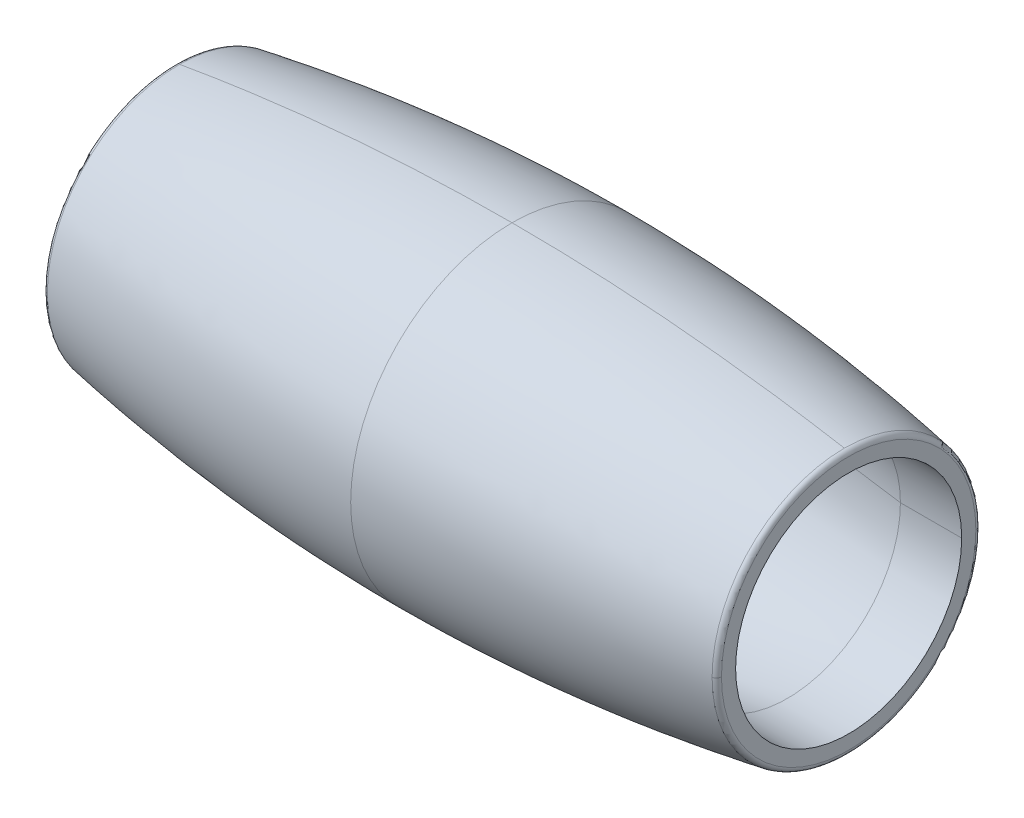
ISO-10303-21;
HEADER;
FILE_DESCRIPTION(('STEP AP214'),'2;1');
FILE_NAME('part.step','',(''),(''),'','','');
FILE_SCHEMA(('AUTOMOTIVE_DESIGN { 1 0 10303 214 1 1 1 1 }'));
ENDSEC;
DATA;
#1=APPLICATION_CONTEXT('core data for automotive mechanical design processes');
#2=APPLICATION_PROTOCOL_DEFINITION('international standard','automotive_design',2000,#1);
#3=PRODUCT_CONTEXT('',#1,'mechanical');
#4=PRODUCT('Part','Part','',(#3));
#5=PRODUCT_RELATED_PRODUCT_CATEGORY('part','',(#4));
#6=PRODUCT_DEFINITION_FORMATION('','',#4);
#7=PRODUCT_DEFINITION_CONTEXT('part definition',#1,'design');
#8=PRODUCT_DEFINITION('design','',#6,#7);
#9=PRODUCT_DEFINITION_SHAPE('','',#8);
#10=(LENGTH_UNIT() NAMED_UNIT(*) SI_UNIT(.MILLI.,.METRE.));
#11=(NAMED_UNIT(*) PLANE_ANGLE_UNIT() SI_UNIT($,.RADIAN.));
#12=(NAMED_UNIT(*) SI_UNIT($,.STERADIAN.) SOLID_ANGLE_UNIT());
#13=UNCERTAINTY_MEASURE_WITH_UNIT(LENGTH_MEASURE(1.E-05),#10,'distance_accuracy_value','');
#14=(GEOMETRIC_REPRESENTATION_CONTEXT(3) GLOBAL_UNCERTAINTY_ASSIGNED_CONTEXT((#13)) GLOBAL_UNIT_ASSIGNED_CONTEXT((#10,
#11,#12)) REPRESENTATION_CONTEXT('',''));
#15=CARTESIAN_POINT('',(0.,0.,0.));
#16=DIRECTION('',(0.,0.,1.));
#17=DIRECTION('',(1.,0.,0.));
#18=AXIS2_PLACEMENT_3D('',#15,#16,#17);
#19=CARTESIAN_POINT('',(-16.31035,0.,0.));
#20=DIRECTION('',(-1.,0.,0.));
#21=DIRECTION('',(0.,0.,-1.));
#22=AXIS2_PLACEMENT_3D('',#19,#20,#21);
#23=TOROIDAL_SURFACE('',#22,6.25877015104272,0.254);
#24=CARTESIAN_POINT('',(-16.31035,0.,6.25877015104273));
#25=DIRECTION('',(0.,-1.,0.));
#26=DIRECTION('',(0.,0.,-1.));
#27=AXIS2_PLACEMENT_3D('',#24,#25,#26);
#28=CIRCLE('',#27,0.254);
#29=CARTESIAN_POINT('',(-16.3540790670224,0.,6.50897760236532));
#30=VERTEX_POINT('',#29);
#31=CARTESIAN_POINT('',(-16.56435,0.,6.25877015104272));
#32=VERTEX_POINT('',#31);
#33=EDGE_CURVE('E277',#30,#32,#28,.T.);
#34=ORIENTED_EDGE('',*,*,#33,.T.);
#35=CARTESIAN_POINT('',(-16.56435,0.,0.));
#36=DIRECTION('',(1.,0.,0.));
#37=DIRECTION('',(0.,0.,1.));
#38=AXIS2_PLACEMENT_3D('',#35,#36,#37);
#39=CIRCLE('',#38,6.25877015104273);
#40=CARTESIAN_POINT('',(-16.56435,0.,-6.25877015104272));
#41=VERTEX_POINT('',#40);
#42=EDGE_CURVE('E216',#32,#41,#39,.T.);
#43=ORIENTED_EDGE('',*,*,#42,.T.);
#44=CARTESIAN_POINT('',(-16.31035,0.,-6.25877015104273));
#45=DIRECTION('',(0.,1.,0.));
#46=DIRECTION('',(0.,0.,1.));
#47=AXIS2_PLACEMENT_3D('',#44,#45,#46);
#48=CIRCLE('',#47,0.254);
#49=CARTESIAN_POINT('',(-16.3540790670224,0.,-6.5089776023653));
#50=VERTEX_POINT('',#49);
#51=EDGE_CURVE('E283',#50,#41,#48,.T.);
#52=ORIENTED_EDGE('',*,*,#51,.F.);
#53=CARTESIAN_POINT('',(-16.3540790670224,0.,0.));
#54=DIRECTION('',(-1.,0.,0.));
#55=DIRECTION('',(0.,0.,-1.));
#56=AXIS2_PLACEMENT_3D('',#53,#54,#55);
#57=CIRCLE('',#56,6.5089776023653);
#58=CARTESIAN_POINT('',(-16.3540790670224,-6.5089776023653,0.));
#59=VERTEX_POINT('',#58);
#60=EDGE_CURVE('E212',#50,#59,#57,.T.);
#61=ORIENTED_EDGE('',*,*,#60,.T.);
#62=CARTESIAN_POINT('',(-16.3540790670224,0.,0.));
#63=DIRECTION('',(-1.,0.,0.));
#64=DIRECTION('',(0.,0.,-1.));
#65=AXIS2_PLACEMENT_3D('',#62,#63,#64);
#66=CIRCLE('',#65,6.5089776023653);
#67=EDGE_CURVE('E243',#59,#30,#66,.T.);
#68=ORIENTED_EDGE('',*,*,#67,.T.);
#69=EDGE_LOOP('',(#34,#43,#52,#61,#68));
#70=FACE_BOUND('',#69,.T.);
#71=ADVANCED_FACE('F51',(#70),#23,.T.);
#72=CARTESIAN_POINT('',(16.31035,0.,0.));
#73=DIRECTION('',(-1.,0.,0.));
#74=DIRECTION('',(0.,0.,-1.));
#75=AXIS2_PLACEMENT_3D('',#72,#73,#74);
#76=TOROIDAL_SURFACE('',#75,6.25877015104272,0.254);
#77=CARTESIAN_POINT('',(16.31035,0.,6.25877015104271));
#78=DIRECTION('',(0.,-1.,0.));
#79=DIRECTION('',(0.,0.,-1.));
#80=AXIS2_PLACEMENT_3D('',#77,#78,#79);
#81=CIRCLE('',#80,0.254);
#82=CARTESIAN_POINT('',(16.56435,0.,6.25877015104273));
#83=VERTEX_POINT('',#82);
#84=CARTESIAN_POINT('',(16.3540790670224,0.,6.5089776023653));
#85=VERTEX_POINT('',#84);
#86=EDGE_CURVE('E231',#83,#85,#81,.T.);
#87=ORIENTED_EDGE('',*,*,#86,.T.);
#88=CARTESIAN_POINT('',(16.3540790670224,0.,0.));
#89=DIRECTION('',(1.,0.,0.));
#90=DIRECTION('',(0.,0.,-1.));
#91=AXIS2_PLACEMENT_3D('',#88,#89,#90);
#92=CIRCLE('',#91,6.50897760236531);
#93=CARTESIAN_POINT('',(16.3540790670224,-6.5089776023653,0.));
#94=VERTEX_POINT('',#93);
#95=EDGE_CURVE('E208',#85,#94,#92,.T.);
#96=ORIENTED_EDGE('',*,*,#95,.T.);
#97=CARTESIAN_POINT('',(16.3540790670224,0.,0.));
#98=DIRECTION('',(1.,0.,0.));
#99=DIRECTION('',(0.,0.,-1.));
#100=AXIS2_PLACEMENT_3D('',#97,#98,#99);
#101=CIRCLE('',#100,6.50897760236531);
#102=CARTESIAN_POINT('',(16.3540790670224,0.,-6.50897760236532));
#103=VERTEX_POINT('',#102);
#104=EDGE_CURVE('E292',#94,#103,#101,.T.);
#105=ORIENTED_EDGE('',*,*,#104,.T.);
#106=CARTESIAN_POINT('',(16.31035,0.,-6.25877015104275));
#107=DIRECTION('',(0.,1.,0.));
#108=DIRECTION('',(0.,0.,1.));
#109=AXIS2_PLACEMENT_3D('',#106,#107,#108);
#110=CIRCLE('',#109,0.254);
#111=CARTESIAN_POINT('',(16.56435,0.,-6.25877015104271));
#112=VERTEX_POINT('',#111);
#113=EDGE_CURVE('E189',#112,#103,#110,.T.);
#114=ORIENTED_EDGE('',*,*,#113,.F.);
#115=CARTESIAN_POINT('',(16.56435,0.,0.));
#116=DIRECTION('',(-1.,0.,0.));
#117=DIRECTION('',(0.,0.,1.));
#118=AXIS2_PLACEMENT_3D('',#115,#116,#117);
#119=CIRCLE('',#118,6.25877015104273);
#120=EDGE_CURVE('E207',#112,#83,#119,.T.);
#121=ORIENTED_EDGE('',*,*,#120,.T.);
#122=EDGE_LOOP('',(#87,#96,#105,#114,#121));
#123=FACE_BOUND('',#122,.T.);
#124=ADVANCED_FACE('F328',(#123),#76,.T.);
#125=CARTESIAN_POINT('',(0.,0.,0.));
#126=DIRECTION('',(-1.,0.,0.));
#127=DIRECTION('',(0.,0.,1.));
#128=AXIS2_PLACEMENT_3D('',#125,#126,#127);
#129=DEGENERATE_TOROIDAL_SURFACE('',#128,87.8040394213596,94.3445394213581,.F.);
#130=CARTESIAN_POINT('',(0.,-1.22857269736749E-13,-87.8040394213598));
#131=DIRECTION('',(0.,-1.,0.));
#132=DIRECTION('',(0.,0.,-1.));
#133=AXIS2_PLACEMENT_3D('',#130,#131,#132);
#134=CIRCLE('',#133,94.3445394213581);
#135=CARTESIAN_POINT('',(13.5485335660357,0.,5.5626));
#136=VERTEX_POINT('',#135);
#137=CARTESIAN_POINT('',(-13.5485335660357,0.,5.5626));
#138=VERTEX_POINT('',#137);
#139=EDGE_CURVE('E164',#136,#138,#134,.T.);
#140=ORIENTED_EDGE('',*,*,#139,.T.);
#141=CARTESIAN_POINT('',(-13.5485335660357,0.,0.));
#142=DIRECTION('',(-1.,0.,0.));
#143=DIRECTION('',(0.,0.,1.));
#144=AXIS2_PLACEMENT_3D('',#141,#142,#143);
#145=CIRCLE('',#144,5.5626);
#146=CARTESIAN_POINT('',(-13.5485335660357,0.,-5.5626));
#147=VERTEX_POINT('',#146);
#148=EDGE_CURVE('E11',#138,#147,#145,.T.);
#149=ORIENTED_EDGE('',*,*,#148,.T.);
#150=CARTESIAN_POINT('',(0.,1.12104376153792E-13,87.8040394213598));
#151=DIRECTION('',(0.,1.,0.));
#152=DIRECTION('',(0.,0.,1.));
#153=AXIS2_PLACEMENT_3D('',#150,#151,#152);
#154=CIRCLE('',#153,94.3445394213581);
#155=CARTESIAN_POINT('',(13.5485335660357,0.,-5.5626));
#156=VERTEX_POINT('',#155);
#157=EDGE_CURVE('E163',#156,#147,#154,.T.);
#158=ORIENTED_EDGE('',*,*,#157,.F.);
#159=CARTESIAN_POINT('',(13.5485335660357,0.,0.));
#160=DIRECTION('',(1.,0.,0.));
#161=DIRECTION('',(0.,0.,-1.));
#162=AXIS2_PLACEMENT_3D('',#159,#160,#161);
#163=CIRCLE('',#162,5.5626);
#164=EDGE_CURVE('E183',#156,#136,#163,.T.);
#165=ORIENTED_EDGE('',*,*,#164,.T.);
#166=EDGE_LOOP('',(#140,#149,#158,#165));
#167=FACE_BOUND('',#166,.T.);
#168=ADVANCED_FACE('F181',(#167),#129,.T.);
#169=CARTESIAN_POINT('',(13.38935,0.,0.));
#170=DIRECTION('',(-1.,0.,0.));
#171=DIRECTION('',(0.,0.,1.));
#172=AXIS2_PLACEMENT_3D('',#169,#170,#171);
#173=CYLINDRICAL_SURFACE('',#172,5.5626);
#174=DIRECTION('',(-1.,0.,0.));
#175=VECTOR('',#174,1.);
#176=CARTESIAN_POINT('',(13.38935,0.,-5.5626));
#177=LINE('',#176,#175);
#178=CARTESIAN_POINT('',(16.56435,0.,-5.5626));
#179=VERTEX_POINT('',#178);
#180=EDGE_CURVE('E197',#179,#156,#177,.T.);
#181=ORIENTED_EDGE('',*,*,#180,.T.);
#182=CARTESIAN_POINT('',(13.5485335660357,0.,0.));
#183=DIRECTION('',(1.,0.,0.));
#184=DIRECTION('',(0.,0.,-1.));
#185=AXIS2_PLACEMENT_3D('',#182,#183,#184);
#186=CIRCLE('',#185,5.5626);
#187=EDGE_CURVE('E174',#136,#156,#186,.T.);
#188=ORIENTED_EDGE('',*,*,#187,.F.);
#189=DIRECTION('',(-1.,0.,0.));
#190=VECTOR('',#189,1.);
#191=CARTESIAN_POINT('',(13.38935,0.,5.5626));
#192=LINE('',#191,#190);
#193=CARTESIAN_POINT('',(16.56435,0.,5.5626));
#194=VERTEX_POINT('',#193);
#195=EDGE_CURVE('E200',#194,#136,#192,.T.);
#196=ORIENTED_EDGE('',*,*,#195,.F.);
#197=CARTESIAN_POINT('',(16.56435,0.,0.));
#198=DIRECTION('',(-1.,0.,0.));
#199=DIRECTION('',(0.,0.,1.));
#200=AXIS2_PLACEMENT_3D('',#197,#198,#199);
#201=CIRCLE('',#200,5.5626);
#202=EDGE_CURVE('E213',#179,#194,#201,.T.);
#203=ORIENTED_EDGE('',*,*,#202,.F.);
#204=EDGE_LOOP('',(#181,#188,#196,#203));
#205=FACE_BOUND('',#204,.T.);
#206=ADVANCED_FACE('F337',(#205),#173,.F.);
#207=CARTESIAN_POINT('',(-13.38935,0.,0.));
#208=DIRECTION('',(1.,0.,0.));
#209=DIRECTION('',(0.,0.,1.));
#210=AXIS2_PLACEMENT_3D('',#207,#208,#209);
#211=CYLINDRICAL_SURFACE('',#210,5.5626);
#212=DIRECTION('',(1.,0.,0.));
#213=VECTOR('',#212,1.);
#214=CARTESIAN_POINT('',(-13.38935,0.,-5.5626));
#215=LINE('',#214,#213);
#216=CARTESIAN_POINT('',(-16.56435,0.,-5.5626));
#217=VERTEX_POINT('',#216);
#218=EDGE_CURVE('E155',#217,#147,#215,.T.);
#219=ORIENTED_EDGE('',*,*,#218,.T.);
#220=ORIENTED_EDGE('',*,*,#148,.F.);
#221=DIRECTION('',(1.,0.,0.));
#222=VECTOR('',#221,1.);
#223=CARTESIAN_POINT('',(-13.38935,0.,5.5626));
#224=LINE('',#223,#222);
#225=CARTESIAN_POINT('',(-16.56435,0.,5.5626));
#226=VERTEX_POINT('',#225);
#227=EDGE_CURVE('E157',#226,#138,#224,.T.);
#228=ORIENTED_EDGE('',*,*,#227,.F.);
#229=CARTESIAN_POINT('',(-16.56435,0.,0.));
#230=DIRECTION('',(-1.,0.,0.));
#231=DIRECTION('',(0.,0.,1.));
#232=AXIS2_PLACEMENT_3D('',#229,#230,#231);
#233=CIRCLE('',#232,5.5626);
#234=EDGE_CURVE('E59',#226,#217,#233,.T.);
#235=ORIENTED_EDGE('',*,*,#234,.T.);
#236=EDGE_LOOP('',(#219,#220,#228,#235));
#237=FACE_BOUND('',#236,.T.);
#238=ADVANCED_FACE('F167',(#237),#211,.F.);
#239=CARTESIAN_POINT('',(-16.56435,1.92641042007225E-12,0.));
#240=DIRECTION('',(1.,0.,0.));
#241=DIRECTION('',(0.,1.,0.));
#242=AXIS2_PLACEMENT_3D('',#239,#240,#241);
#243=PLANE('',#242);
#244=ORIENTED_EDGE('',*,*,#234,.F.);
#245=CARTESIAN_POINT('',(-16.56435,0.,0.));
#246=DIRECTION('',(-1.,0.,0.));
#247=DIRECTION('',(0.,0.,1.));
#248=AXIS2_PLACEMENT_3D('',#245,#246,#247);
#249=CIRCLE('',#248,5.5626);
#250=EDGE_CURVE('E71',#217,#226,#249,.T.);
#251=ORIENTED_EDGE('',*,*,#250,.F.);
#252=EDGE_LOOP('',(#244,#251));
#253=FACE_BOUND('',#252,.T.);
#254=CARTESIAN_POINT('',(-16.56435,0.,0.));
#255=DIRECTION('',(1.,0.,0.));
#256=DIRECTION('',(0.,0.,1.));
#257=AXIS2_PLACEMENT_3D('',#254,#255,#256);
#258=CIRCLE('',#257,6.25877015104273);
#259=EDGE_CURVE('E280',#41,#32,#258,.T.);
#260=ORIENTED_EDGE('',*,*,#259,.F.);
#261=ORIENTED_EDGE('',*,*,#42,.F.);
#262=EDGE_LOOP('',(#260,#261));
#263=FACE_BOUND('',#262,.T.);
#264=ADVANCED_FACE('F350',(#253,#263),#243,.F.);
#265=CARTESIAN_POINT('',(0.,-7.9375,0.));
#266=CARTESIAN_POINT('',(0.,-7.93750000000004,-15.8750000000001));
#267=CARTESIAN_POINT('',(0.,7.93750000000001,-15.8750000000001));
#268=CARTESIAN_POINT('',(0.,7.9375,0.));
#269=CARTESIAN_POINT('',(-0.236993339572965,-7.93698065903924,0.));
#270=CARTESIAN_POINT('',(-0.236993339572967,-7.93698065903926,-15.8739613180784));
#271=CARTESIAN_POINT('',(-0.236993339572968,7.9369806590392,-15.8739613180785));
#272=CARTESIAN_POINT('',(-0.236993339572967,7.93698065903919,0.));
#273=CARTESIAN_POINT('',(-0.711031186077695,-7.9359418649908,0.));
#274=CARTESIAN_POINT('',(-0.711031186077697,-7.93594186499081,-15.8718837299815));
#275=CARTESIAN_POINT('',(-0.711031186077698,7.93594186499075,-15.8718837299816));
#276=CARTESIAN_POINT('',(-0.711031186077697,7.93594186499074,0.));
#277=CARTESIAN_POINT('',(-1.42217497769895,-7.92753824154268,0.));
#278=CARTESIAN_POINT('',(-1.42217497769895,-7.92753824154266,-15.8550764830853));
#279=CARTESIAN_POINT('',(-1.42217497769895,7.92753824154266,-15.8550764830853));
#280=CARTESIAN_POINT('',(-1.42217497769895,7.92753824154263,0.));
#281=CARTESIAN_POINT('',(-2.13354417512343,-7.91411784591121,0.));
#282=CARTESIAN_POINT('',(-2.13354417512343,-7.91411784591118,-15.8282356918224));
#283=CARTESIAN_POINT('',(-2.13354417512343,7.91411784591121,-15.8282356918224));
#284=CARTESIAN_POINT('',(-2.13354417512343,7.91411784591116,0.));
#285=CARTESIAN_POINT('',(-2.84525197057992,-7.89518029330384,0.));
#286=CARTESIAN_POINT('',(-2.84525197057991,-7.89518029330388,-15.7903605866076));
#287=CARTESIAN_POINT('',(-2.84525197057991,7.89518029330376,-15.7903605866076));
#288=CARTESIAN_POINT('',(-2.84525197057992,7.89518029330379,0.));
#289=CARTESIAN_POINT('',(-4.51155009392911,-7.83824128609203,0.));
#290=CARTESIAN_POINT('',(-4.5115500939291,-7.83824128609201,-15.676482572184));
#291=CARTESIAN_POINT('',(-4.5115500939291,7.83824128609201,-15.676482572184));
#292=CARTESIAN_POINT('',(-4.51155009392911,7.83824128609197,0.));
#293=CARTESIAN_POINT('',(-6.65975268218653,-7.71558946436912,0.));
#294=CARTESIAN_POINT('',(-6.65975268218653,-7.71558946436912,-15.4311789287382));
#295=CARTESIAN_POINT('',(-6.65975268218653,7.71558946436906,-15.4311789287382));
#296=CARTESIAN_POINT('',(-6.65975268218653,7.71558946436906,0.));
#297=CARTESIAN_POINT('',(-9.53457826128339,-7.46356973035375,0.));
#298=CARTESIAN_POINT('',(-9.53457826128339,-7.46356973035373,-14.9271394607075));
#299=CARTESIAN_POINT('',(-9.53457826128339,7.46356973035372,-14.9271394607074));
#300=CARTESIAN_POINT('',(-9.53457826128339,7.46356973035369,0.));
#301=CARTESIAN_POINT('',(-11.9508229413513,-7.18643971065879,0.));
#302=CARTESIAN_POINT('',(-11.9508229413513,-7.18643971065877,-14.3728794213176));
#303=CARTESIAN_POINT('',(-11.9508229413513,7.18643971065878,-14.3728794213175));
#304=CARTESIAN_POINT('',(-11.9508229413513,7.18643971065874,0.));
#305=CARTESIAN_POINT('',(-14.3065532202125,-6.85216872985062,0.));
#306=CARTESIAN_POINT('',(-14.3065532202125,-6.85216872985063,-13.7043374597012));
#307=CARTESIAN_POINT('',(-14.3065532202125,6.85216872985057,-13.7043374597012));
#308=CARTESIAN_POINT('',(-14.3065532202125,6.85216872985056,0.));
#309=CARTESIAN_POINT('',(-15.6953402998447,-6.62410619485122,0.));
#310=CARTESIAN_POINT('',(-15.6953402998447,-6.6241061948512,-13.2482123897024));
#311=CARTESIAN_POINT('',(-15.6953402998447,6.6241061948512,-13.2482123897024));
#312=CARTESIAN_POINT('',(-15.6953402998447,6.62410619485116,0.));
#313=CARTESIAN_POINT('',(-16.3540790670224,-6.50897760236535,0.));
#314=CARTESIAN_POINT('',(-16.3540790670224,-6.50897760236533,-13.0179552047307));
#315=CARTESIAN_POINT('',(-16.3540790670224,6.50897760236533,-13.0179552047306));
#316=CARTESIAN_POINT('',(-16.3540790670224,6.50897760236529,0.));
#317=(BOUNDED_SURFACE() B_SPLINE_SURFACE(3,3,((#265,#266,#267,#268),(#269,#270,#271,#272),(#273,
#274,#275,#276),(#277,#278,#279,#280),(#281,#282,#283,#284),(#285,#286,#287,#288),(#289,#290,
#291,#292),(#293,#294,#295,#296),(#297,#298,#299,#300),(#301,#302,#303,#304),(#305,#306,#307,
#308),(#309,#310,#311,#312),(#313,#314,#315,#316)),.UNSPECIFIED.,.F.,.F.,
.F.) B_SPLINE_SURFACE_WITH_KNOTS((4,1,1,1,1,1,1,1,1,1,4),(4,4),(0.,0.017943719109145,
0.0358913123048645,0.0538466600907059,0.0718136558601029,0.0897962125048475,0.180081554578632,
0.234698135698095,0.308281361292124,0.364202985181638,0.414834736352406),(0.,1.),
.UNSPECIFIED.) GEOMETRIC_REPRESENTATION_ITEM() RATIONAL_B_SPLINE_SURFACE(((1.,0.333333333333333,
0.333333333333333,1.),(1.,0.333333333333333,0.333333333333333,1.),(1.,0.333333333333333,
0.333333333333333,1.),(1.,0.333333333333333,0.333333333333333,1.),(1.,0.333333333333333,
0.333333333333333,1.),(1.,0.333333333333333,0.333333333333333,1.),(1.,0.333333333333333,
0.333333333333333,1.),(1.,0.333333333333333,0.333333333333333,1.),(1.,0.333333333333333,
0.333333333333333,1.),(1.,0.333333333333333,0.333333333333333,1.),(1.,0.333333333333333,
0.333333333333333,1.),(1.,0.333333333333333,0.333333333333333,1.),(1.,0.333333333333333,
0.333333333333333,1.))) REPRESENTATION_ITEM('') SURFACE());
#318=CARTESIAN_POINT('',(0.,-7.9375,0.));
#319=CARTESIAN_POINT('',(-0.236993339572965,-7.93698065903924,0.));
#320=CARTESIAN_POINT('',(-0.711031186077695,-7.9359418649908,0.));
#321=CARTESIAN_POINT('',(-1.42217497769895,-7.92753824154268,0.));
#322=CARTESIAN_POINT('',(-2.13354417512343,-7.91411784591121,0.));
#323=CARTESIAN_POINT('',(-2.84525197057992,-7.89518029330384,0.));
#324=CARTESIAN_POINT('',(-4.51155009392911,-7.83824128609203,0.));
#325=CARTESIAN_POINT('',(-6.65975268218653,-7.71558946436912,0.));
#326=CARTESIAN_POINT('',(-9.53457826128339,-7.46356973035375,0.));
#327=CARTESIAN_POINT('',(-11.9508229413513,-7.18643971065879,0.));
#328=CARTESIAN_POINT('',(-14.3065532202122,-6.85216872985066,0.));
#329=CARTESIAN_POINT('',(-15.6953402998442,-6.6241061948513,0.));
#330=CARTESIAN_POINT('',(-16.3540790670224,-6.5089776023653,0.));
#331=(BOUNDED_CURVE() B_SPLINE_CURVE(3,(#318,#319,#320,#321,#322,#323,#324,#325,#326,#327,#328,
#329,#330),.UNSPECIFIED.,.F.,.F.) B_SPLINE_CURVE_WITH_KNOTS((4,1,1,1,1,1,1,1,1,1,4),(0.,
0.017943719109145,0.0358913123048645,0.0538466600907059,0.0718136558601029,0.0897962125048475,
0.180081554578632,0.234698135698095,0.308281361292124,0.364202985181638,0.414834736352387),
.UNSPECIFIED.) CURVE() GEOMETRIC_REPRESENTATION_ITEM() RATIONAL_B_SPLINE_CURVE((1.,1.,1.,1.,1.,
1.,1.,1.,1.,1.,1.,1.,1.)) REPRESENTATION_ITEM(''));
#332=CARTESIAN_POINT('',(0.,-7.9375,0.));
#333=VERTEX_POINT('',#332);
#334=EDGE_CURVE('E238',#333,#59,#331,.T.);
#335=CARTESIAN_POINT('',(-16.3540790670224,0.,0.));
#336=DIRECTION('',(-1.,0.,0.));
#337=DIRECTION('',(0.,0.,-1.));
#338=AXIS2_PLACEMENT_3D('',#335,#336,#337);
#339=CIRCLE('',#338,6.5089776023653);
#340=CARTESIAN_POINT('',(-16.3540790670224,6.50897760236529,0.));
#341=VERTEX_POINT('',#340);
#342=EDGE_CURVE('E258',#341,#50,#339,.T.);
#343=CARTESIAN_POINT('',(0.,7.9375,0.));
#344=CARTESIAN_POINT('',(-0.236993339572939,7.93698065903919,0.));
#345=CARTESIAN_POINT('',(-0.71103118607767,7.93594186499074,0.));
#346=CARTESIAN_POINT('',(-1.42217497769893,7.92753824154263,0.));
#347=CARTESIAN_POINT('',(-2.13354417512341,7.91411784591116,0.));
#348=CARTESIAN_POINT('',(-2.84525197057989,7.89518029330379,0.));
#349=CARTESIAN_POINT('',(-4.51155009392909,7.83824128609197,0.));
#350=CARTESIAN_POINT('',(-6.65975268218651,7.71558946436906,0.));
#351=CARTESIAN_POINT('',(-9.53457826128337,7.46356973035369,0.));
#352=CARTESIAN_POINT('',(-11.9508229413513,7.18643971065874,0.));
#353=CARTESIAN_POINT('',(-14.3065532202122,6.8521687298506,0.));
#354=CARTESIAN_POINT('',(-15.6953402998442,6.62410619485124,0.));
#355=CARTESIAN_POINT('',(-16.3540790670224,6.50897760236529,0.));
#356=(BOUNDED_CURVE() B_SPLINE_CURVE(3,(#343,#344,#345,#346,#347,#348,#349,#350,#351,#352,#353,
#354,#355),.UNSPECIFIED.,.F.,.F.) B_SPLINE_CURVE_WITH_KNOTS((4,1,1,1,1,1,1,1,1,1,4),(0.,
0.017943719109145,0.0358913123048645,0.0538466600907059,0.0718136558601029,0.0897962125048475,
0.180081554578632,0.234698135698095,0.308281361292124,0.364202985181638,0.414834736352387),
.UNSPECIFIED.) CURVE() GEOMETRIC_REPRESENTATION_ITEM() RATIONAL_B_SPLINE_CURVE((1.,1.,1.,1.,1.,
1.,1.,1.,1.,1.,1.,1.,1.)) REPRESENTATION_ITEM(''));
#357=CARTESIAN_POINT('',(0.,7.9375,0.));
#358=VERTEX_POINT('',#357);
#359=EDGE_CURVE('E259',#358,#341,#356,.T.);
#360=CARTESIAN_POINT('',(0.,0.,0.));
#361=DIRECTION('',(1.,0.,0.));
#362=DIRECTION('',(0.,0.,-1.));
#363=AXIS2_PLACEMENT_3D('',#360,#361,#362);
#364=CIRCLE('',#363,7.9375);
#365=EDGE_CURVE('E265',#333,#358,#364,.T.);
#366=ORIENTED_EDGE('',*,*,#334,.T.);
#367=ORIENTED_EDGE('',*,*,#60,.F.);
#368=ORIENTED_EDGE('',*,*,#342,.F.);
#369=ORIENTED_EDGE('',*,*,#359,.F.);
#370=ORIENTED_EDGE('',*,*,#365,.F.);
#371=EDGE_LOOP('',(#366,#367,#368,#369,#370));
#372=FACE_BOUND('',#371,.T.);
#373=ADVANCED_FACE('F323',(#372),#317,.T.);
#374=CARTESIAN_POINT('',(0.,7.9375,0.));
#375=CARTESIAN_POINT('',(0.,7.93750000000004,15.8750000000001));
#376=CARTESIAN_POINT('',(0.,-7.93750000000007,15.8750000000001));
#377=CARTESIAN_POINT('',(0.,-7.9375,0.));
#378=CARTESIAN_POINT('',(0.236993339572934,7.93698065903918,0.));
#379=CARTESIAN_POINT('',(0.236993339572936,7.93698065903922,15.8739613180785));
#380=CARTESIAN_POINT('',(0.236993339572937,-7.93698065903927,15.8739613180785));
#381=CARTESIAN_POINT('',(0.236993339572936,-7.93698065903923,0.));
#382=CARTESIAN_POINT('',(0.71103118607767,7.93594186499075,0.));
#383=CARTESIAN_POINT('',(0.711031186077672,7.93594186499081,15.8718837299816));
#384=CARTESIAN_POINT('',(0.711031186077673,-7.93594186499081,15.8718837299816));
#385=CARTESIAN_POINT('',(0.711031186077671,-7.9359418649908,0.));
#386=CARTESIAN_POINT('',(1.42217497769892,7.92753824154263,0.));
#387=CARTESIAN_POINT('',(1.42217497769893,7.92753824154263,15.8550764830854));
#388=CARTESIAN_POINT('',(1.42217497769893,-7.92753824154275,15.8550764830853));
#389=CARTESIAN_POINT('',(1.42217497769892,-7.92753824154268,0.));
#390=CARTESIAN_POINT('',(2.13354417512338,7.91411784591116,0.));
#391=CARTESIAN_POINT('',(2.13354417512338,7.9141178459112,15.8282356918224));
#392=CARTESIAN_POINT('',(2.13354417512338,-7.91411784591125,15.8282356918224));
#393=CARTESIAN_POINT('',(2.13354417512338,-7.91411784591121,0.));
#394=CARTESIAN_POINT('',(2.84525197057991,7.89518029330378,0.));
#395=CARTESIAN_POINT('',(2.8452519705799,7.89518029330379,15.7903605866077));
#396=CARTESIAN_POINT('',(2.84525197057991,-7.89518029330389,15.7903605866077));
#397=CARTESIAN_POINT('',(2.84525197057991,-7.89518029330383,0.));
#398=CARTESIAN_POINT('',(4.51155009392909,7.83824128609197,0.));
#399=CARTESIAN_POINT('',(4.51155009392909,7.83824128609202,15.676482572184));
#400=CARTESIAN_POINT('',(4.51155009392909,-7.83824128609203,15.676482572184));
#401=CARTESIAN_POINT('',(4.51155009392909,-7.83824128609202,0.));
#402=CARTESIAN_POINT('',(6.65975268218651,7.71558946436907,0.));
#403=CARTESIAN_POINT('',(6.65975268218652,7.71558946436916,15.4311789287382));
#404=CARTESIAN_POINT('',(6.65975268218652,-7.7155894643691,15.4311789287383));
#405=CARTESIAN_POINT('',(6.65975268218652,-7.71558946436912,0.));
#406=CARTESIAN_POINT('',(9.53457826128336,7.46356973035372,0.));
#407=CARTESIAN_POINT('',(9.53457826128335,7.46356973035376,14.9271394607075));
#408=CARTESIAN_POINT('',(9.53457826128337,-7.46356973035379,14.9271394607075));
#409=CARTESIAN_POINT('',(9.53457826128336,-7.46356973035377,0.));
#410=CARTESIAN_POINT('',(11.9508229413513,7.18643971065873,0.));
#411=CARTESIAN_POINT('',(11.9508229413513,7.18643971065873,14.3728794213176));
#412=CARTESIAN_POINT('',(11.9508229413513,-7.18643971065885,14.3728794213175));
#413=CARTESIAN_POINT('',(11.9508229413513,-7.18643971065879,0.));
#414=CARTESIAN_POINT('',(14.3065532202124,6.85216872985056,0.));
#415=CARTESIAN_POINT('',(14.3065532202124,6.85216872985056,13.7043374597012));
#416=CARTESIAN_POINT('',(14.3065532202124,-6.85216872985066,13.7043374597012));
#417=CARTESIAN_POINT('',(14.3065532202124,-6.85216872985061,0.));
#418=CARTESIAN_POINT('',(15.6953402998446,6.62410619485117,0.));
#419=CARTESIAN_POINT('',(15.6953402998447,6.62410619485114,13.2482123897025));
#420=CARTESIAN_POINT('',(15.6953402998447,-6.62410619485131,13.2482123897024));
#421=CARTESIAN_POINT('',(15.6953402998446,-6.62410619485122,0.));
#422=CARTESIAN_POINT('',(16.3540790670224,6.5089776023653,0.));
#423=CARTESIAN_POINT('',(16.3540790670224,6.50897760236527,13.0179552047307));
#424=CARTESIAN_POINT('',(16.3540790670224,-6.50897760236544,13.0179552047307));
#425=CARTESIAN_POINT('',(16.3540790670224,-6.50897760236535,0.));
#426=(BOUNDED_SURFACE() B_SPLINE_SURFACE(3,3,((#374,#375,#376,#377),(#378,#379,#380,#381),(#382,
#383,#384,#385),(#386,#387,#388,#389),(#390,#391,#392,#393),(#394,#395,#396,#397),(#398,#399,
#400,#401),(#402,#403,#404,#405),(#406,#407,#408,#409),(#410,#411,#412,#413),(#414,#415,#416,
#417),(#418,#419,#420,#421),(#422,#423,#424,#425)),.UNSPECIFIED.,.F.,.F.,
.F.) B_SPLINE_SURFACE_WITH_KNOTS((4,1,1,1,1,1,1,1,1,1,4),(4,4),(0.,0.017943719109145,
0.0358913123048645,0.0538466600907059,0.0718136558601029,0.0897962125048475,0.180081554578632,
0.234698135698095,0.308281361292124,0.364202985181638,0.414834736352406),(0.,1.),
.UNSPECIFIED.) GEOMETRIC_REPRESENTATION_ITEM() RATIONAL_B_SPLINE_SURFACE(((1.,0.333333333333332,
0.333333333333332,1.),(1.,0.333333333333332,0.333333333333332,1.),(1.,0.333333333333332,
0.333333333333332,1.),(1.,0.333333333333332,0.333333333333332,1.),(1.,0.333333333333332,
0.333333333333332,1.),(1.,0.333333333333332,0.333333333333332,1.),(1.,0.333333333333332,
0.333333333333332,1.),(1.,0.333333333333332,0.333333333333332,1.),(1.,0.333333333333332,
0.333333333333332,1.),(1.,0.333333333333332,0.333333333333332,1.),(1.,0.333333333333332,
0.333333333333332,1.),(1.,0.333333333333332,0.333333333333332,1.),(1.,0.333333333333332,
0.333333333333332,1.))) REPRESENTATION_ITEM('') SURFACE());
#427=CARTESIAN_POINT('',(0.,-7.9375,0.));
#428=CARTESIAN_POINT('',(0.236993339572908,-7.93698065903923,0.));
#429=CARTESIAN_POINT('',(0.711031186077643,-7.9359418649908,0.));
#430=CARTESIAN_POINT('',(1.42217497769889,-7.92753824154268,0.));
#431=CARTESIAN_POINT('',(2.13354417512335,-7.91411784591121,0.));
#432=CARTESIAN_POINT('',(2.84525197057988,-7.89518029330383,0.));
#433=CARTESIAN_POINT('',(4.51155009392905,-7.83824128609202,0.));
#434=CARTESIAN_POINT('',(6.65975268218648,-7.71558946436912,0.));
#435=CARTESIAN_POINT('',(9.53457826128332,-7.46356973035377,0.));
#436=CARTESIAN_POINT('',(11.9508229413513,-7.18643971065879,0.));
#437=CARTESIAN_POINT('',(14.3065532202122,-6.85216872985064,0.));
#438=CARTESIAN_POINT('',(15.6953402998441,-6.6241061948513,0.));
#439=CARTESIAN_POINT('',(16.3540790670224,-6.5089776023653,0.));
#440=(BOUNDED_CURVE() B_SPLINE_CURVE(3,(#427,#428,#429,#430,#431,#432,#433,#434,#435,#436,#437,
#438,#439),.UNSPECIFIED.,.F.,.F.) B_SPLINE_CURVE_WITH_KNOTS((4,1,1,1,1,1,1,1,1,1,4),(0.,
0.017943719109145,0.0358913123048645,0.0538466600907059,0.0718136558601029,0.0897962125048475,
0.180081554578632,0.234698135698095,0.308281361292124,0.364202985181638,0.414834736352389),
.UNSPECIFIED.) CURVE() GEOMETRIC_REPRESENTATION_ITEM() RATIONAL_B_SPLINE_CURVE((1.,1.,1.,1.,1.,
1.,1.,1.,1.,1.,1.,1.,1.)) REPRESENTATION_ITEM(''));
#441=EDGE_CURVE('E288',#333,#94,#440,.T.);
#442=CARTESIAN_POINT('',(16.3540790670224,0.,0.));
#443=DIRECTION('',(1.,0.,0.));
#444=DIRECTION('',(0.,0.,-1.));
#445=AXIS2_PLACEMENT_3D('',#442,#443,#444);
#446=CIRCLE('',#445,6.50897760236531);
#447=CARTESIAN_POINT('',(16.3540790670224,6.5089776023653,0.));
#448=VERTEX_POINT('',#447);
#449=EDGE_CURVE('E192',#448,#85,#446,.T.);
#450=CARTESIAN_POINT('',(0.,7.9375,0.));
#451=CARTESIAN_POINT('',(0.236993339572934,7.93698065903918,0.));
#452=CARTESIAN_POINT('',(0.71103118607767,7.93594186499075,0.));
#453=CARTESIAN_POINT('',(1.42217497769892,7.92753824154263,0.));
#454=CARTESIAN_POINT('',(2.13354417512338,7.91411784591116,0.));
#455=CARTESIAN_POINT('',(2.84525197057991,7.89518029330378,0.));
#456=CARTESIAN_POINT('',(4.51155009392909,7.83824128609197,0.));
#457=CARTESIAN_POINT('',(6.65975268218651,7.71558946436907,0.));
#458=CARTESIAN_POINT('',(9.53457826128336,7.46356973035372,0.));
#459=CARTESIAN_POINT('',(11.9508229413513,7.18643971065873,0.));
#460=CARTESIAN_POINT('',(14.3065532202122,6.8521687298506,0.));
#461=CARTESIAN_POINT('',(15.6953402998441,6.62410619485125,0.));
#462=CARTESIAN_POINT('',(16.3540790670224,6.5089776023653,0.));
#463=(BOUNDED_CURVE() B_SPLINE_CURVE(3,(#450,#451,#452,#453,#454,#455,#456,#457,#458,#459,#460,
#461,#462),.UNSPECIFIED.,.F.,.F.) B_SPLINE_CURVE_WITH_KNOTS((4,1,1,1,1,1,1,1,1,1,4),(0.,
0.017943719109145,0.0358913123048645,0.0538466600907059,0.0718136558601029,0.0897962125048475,
0.180081554578632,0.234698135698095,0.308281361292124,0.364202985181638,0.414834736352387),
.UNSPECIFIED.) CURVE() GEOMETRIC_REPRESENTATION_ITEM() RATIONAL_B_SPLINE_CURVE((1.,1.,1.,1.,1.,
1.,1.,1.,1.,1.,1.,1.,1.)) REPRESENTATION_ITEM(''));
#464=EDGE_CURVE('E281',#358,#448,#463,.T.);
#465=CARTESIAN_POINT('',(0.,0.,0.));
#466=DIRECTION('',(1.,0.,0.));
#467=DIRECTION('',(0.,0.,-1.));
#468=AXIS2_PLACEMENT_3D('',#465,#466,#467);
#469=CIRCLE('',#468,7.9375);
#470=EDGE_CURVE('E234',#358,#333,#469,.T.);
#471=ORIENTED_EDGE('',*,*,#441,.T.);
#472=ORIENTED_EDGE('',*,*,#95,.F.);
#473=ORIENTED_EDGE('',*,*,#449,.F.);
#474=ORIENTED_EDGE('',*,*,#464,.F.);
#475=ORIENTED_EDGE('',*,*,#470,.T.);
#476=EDGE_LOOP('',(#471,#472,#473,#474,#475));
#477=FACE_BOUND('',#476,.T.);
#478=ADVANCED_FACE('F342',(#477),#426,.F.);
#479=CARTESIAN_POINT('',(16.56435,1.92380833485828E-12,0.));
#480=DIRECTION('',(1.,0.,0.));
#481=DIRECTION('',(0.,1.,0.));
#482=AXIS2_PLACEMENT_3D('',#479,#480,#481);
#483=PLANE('',#482);
#484=CARTESIAN_POINT('',(16.56435,0.,0.));
#485=DIRECTION('',(-1.,0.,0.));
#486=DIRECTION('',(0.,0.,1.));
#487=AXIS2_PLACEMENT_3D('',#484,#485,#486);
#488=CIRCLE('',#487,5.5626);
#489=EDGE_CURVE('E179',#194,#179,#488,.T.);
#490=ORIENTED_EDGE('',*,*,#489,.T.);
#491=ORIENTED_EDGE('',*,*,#202,.T.);
#492=EDGE_LOOP('',(#490,#491));
#493=FACE_BOUND('',#492,.T.);
#494=ORIENTED_EDGE('',*,*,#120,.F.);
#495=CARTESIAN_POINT('',(16.56435,0.,0.));
#496=DIRECTION('',(-1.,0.,0.));
#497=DIRECTION('',(0.,0.,1.));
#498=AXIS2_PLACEMENT_3D('',#495,#496,#497);
#499=CIRCLE('',#498,6.25877015104273);
#500=EDGE_CURVE('E254',#83,#112,#499,.T.);
#501=ORIENTED_EDGE('',*,*,#500,.F.);
#502=EDGE_LOOP('',(#494,#501));
#503=FACE_BOUND('',#502,.T.);
#504=ADVANCED_FACE('F367',(#493,#503),#483,.T.);
#505=CARTESIAN_POINT('',(-13.38935,0.,0.));
#506=DIRECTION('',(1.,0.,0.));
#507=DIRECTION('',(0.,0.,1.));
#508=AXIS2_PLACEMENT_3D('',#505,#506,#507);
#509=CYLINDRICAL_SURFACE('',#508,5.5626);
#510=ORIENTED_EDGE('',*,*,#250,.T.);
#511=ORIENTED_EDGE('',*,*,#227,.T.);
#512=CARTESIAN_POINT('',(-13.5485335660357,0.,0.));
#513=DIRECTION('',(-1.,0.,0.));
#514=DIRECTION('',(0.,0.,1.));
#515=AXIS2_PLACEMENT_3D('',#512,#513,#514);
#516=CIRCLE('',#515,5.5626);
#517=EDGE_CURVE('E152',#147,#138,#516,.T.);
#518=ORIENTED_EDGE('',*,*,#517,.F.);
#519=ORIENTED_EDGE('',*,*,#218,.F.);
#520=EDGE_LOOP('',(#510,#511,#518,#519));
#521=FACE_BOUND('',#520,.T.);
#522=ADVANCED_FACE('F154',(#521),#509,.F.);
#523=CARTESIAN_POINT('',(13.38935,0.,0.));
#524=DIRECTION('',(-1.,0.,0.));
#525=DIRECTION('',(0.,0.,1.));
#526=AXIS2_PLACEMENT_3D('',#523,#524,#525);
#527=CYLINDRICAL_SURFACE('',#526,5.5626);
#528=ORIENTED_EDGE('',*,*,#489,.F.);
#529=ORIENTED_EDGE('',*,*,#195,.T.);
#530=ORIENTED_EDGE('',*,*,#164,.F.);
#531=ORIENTED_EDGE('',*,*,#180,.F.);
#532=EDGE_LOOP('',(#528,#529,#530,#531));
#533=FACE_BOUND('',#532,.T.);
#534=ADVANCED_FACE('F365',(#533),#527,.F.);
#535=CARTESIAN_POINT('',(0.,0.,0.));
#536=DIRECTION('',(-1.,0.,0.));
#537=DIRECTION('',(0.,0.,1.));
#538=AXIS2_PLACEMENT_3D('',#535,#536,#537);
#539=DEGENERATE_TOROIDAL_SURFACE('',#538,87.8040394213596,94.3445394213581,.F.);
#540=ORIENTED_EDGE('',*,*,#187,.T.);
#541=ORIENTED_EDGE('',*,*,#157,.T.);
#542=ORIENTED_EDGE('',*,*,#517,.T.);
#543=ORIENTED_EDGE('',*,*,#139,.F.);
#544=EDGE_LOOP('',(#540,#541,#542,#543));
#545=FACE_BOUND('',#544,.T.);
#546=ADVANCED_FACE('F172',(#545),#539,.T.);
#547=CARTESIAN_POINT('',(16.31035,0.,0.));
#548=DIRECTION('',(-1.,0.,0.));
#549=DIRECTION('',(0.,0.,-1.));
#550=AXIS2_PLACEMENT_3D('',#547,#548,#549);
#551=TOROIDAL_SURFACE('',#550,6.25877015104272,0.254);
#552=ORIENTED_EDGE('',*,*,#500,.T.);
#553=ORIENTED_EDGE('',*,*,#113,.T.);
#554=CARTESIAN_POINT('',(16.3540790670224,0.,0.));
#555=DIRECTION('',(1.,0.,0.));
#556=DIRECTION('',(0.,0.,-1.));
#557=AXIS2_PLACEMENT_3D('',#554,#555,#556);
#558=CIRCLE('',#557,6.50897760236531);
#559=EDGE_CURVE('E289',#103,#448,#558,.T.);
#560=ORIENTED_EDGE('',*,*,#559,.T.);
#561=ORIENTED_EDGE('',*,*,#449,.T.);
#562=ORIENTED_EDGE('',*,*,#86,.F.);
#563=EDGE_LOOP('',(#552,#553,#560,#561,#562));
#564=FACE_BOUND('',#563,.T.);
#565=ADVANCED_FACE('F377',(#564),#551,.T.);
#566=CARTESIAN_POINT('',(-16.31035,0.,0.));
#567=DIRECTION('',(-1.,0.,0.));
#568=DIRECTION('',(0.,0.,-1.));
#569=AXIS2_PLACEMENT_3D('',#566,#567,#568);
#570=TOROIDAL_SURFACE('',#569,6.25877015104272,0.254);
#571=CARTESIAN_POINT('',(-16.3540790670224,0.,0.));
#572=DIRECTION('',(-1.,0.,0.));
#573=DIRECTION('',(0.,0.,-1.));
#574=AXIS2_PLACEMENT_3D('',#571,#572,#573);
#575=CIRCLE('',#574,6.5089776023653);
#576=EDGE_CURVE('E253',#30,#341,#575,.T.);
#577=ORIENTED_EDGE('',*,*,#576,.T.);
#578=ORIENTED_EDGE('',*,*,#342,.T.);
#579=ORIENTED_EDGE('',*,*,#51,.T.);
#580=ORIENTED_EDGE('',*,*,#259,.T.);
#581=ORIENTED_EDGE('',*,*,#33,.F.);
#582=EDGE_LOOP('',(#577,#578,#579,#580,#581));
#583=FACE_BOUND('',#582,.T.);
#584=ADVANCED_FACE('F319',(#583),#570,.T.);
#585=CARTESIAN_POINT('',(0.,-7.9375,0.));
#586=CARTESIAN_POINT('',(0.,-7.93750000000008,-15.8750000000001));
#587=CARTESIAN_POINT('',(0.,7.93750000000002,-15.8750000000001));
#588=CARTESIAN_POINT('',(0.,7.9375,0.));
#589=CARTESIAN_POINT('',(0.236993339572908,-7.93698065903923,0.));
#590=CARTESIAN_POINT('',(0.236993339572905,-7.93698065903928,-15.8739613180785));
#591=CARTESIAN_POINT('',(0.236993339572904,7.93698065903921,-15.8739613180785));
#592=CARTESIAN_POINT('',(0.236993339572905,7.93698065903918,0.));
#593=CARTESIAN_POINT('',(0.711031186077643,-7.9359418649908,0.));
#594=CARTESIAN_POINT('',(0.71103118607764,-7.93594186499087,-15.8718837299816));
#595=CARTESIAN_POINT('',(0.711031186077639,7.93594186499075,-15.8718837299816));
#596=CARTESIAN_POINT('',(0.711031186077641,7.93594186499075,0.));
#597=CARTESIAN_POINT('',(1.42217497769889,-7.92753824154268,0.));
#598=CARTESIAN_POINT('',(1.42217497769889,-7.92753824154267,-15.8550764830854));
#599=CARTESIAN_POINT('',(1.42217497769889,7.92753824154269,-15.8550764830853));
#600=CARTESIAN_POINT('',(1.42217497769889,7.92753824154263,0.));
#601=CARTESIAN_POINT('',(2.13354417512335,-7.91411784591121,0.));
#602=CARTESIAN_POINT('',(2.13354417512335,-7.91411784591125,-15.8282356918224));
#603=CARTESIAN_POINT('',(2.13354417512335,7.91411784591119,-15.8282356918224));
#604=CARTESIAN_POINT('',(2.13354417512334,7.91411784591116,0.));
#605=CARTESIAN_POINT('',(2.84525197057988,-7.89518029330383,0.));
#606=CARTESIAN_POINT('',(2.84525197057987,-7.89518029330385,-15.7903605866077));
#607=CARTESIAN_POINT('',(2.84525197057987,7.89518029330383,-15.7903605866077));
#608=CARTESIAN_POINT('',(2.84525197057988,7.89518029330378,0.));
#609=CARTESIAN_POINT('',(4.51155009392905,-7.83824128609202,0.));
#610=CARTESIAN_POINT('',(4.51155009392906,-7.83824128609208,-15.676482572184));
#611=CARTESIAN_POINT('',(4.51155009392906,7.83824128609197,-15.676482572184));
#612=CARTESIAN_POINT('',(4.51155009392905,7.83824128609197,0.));
#613=CARTESIAN_POINT('',(6.65975268218648,-7.71558946436912,0.));
#614=CARTESIAN_POINT('',(6.65975268218649,-7.71558946436922,-15.4311789287382));
#615=CARTESIAN_POINT('',(6.65975268218649,7.71558946436904,-15.4311789287383));
#616=CARTESIAN_POINT('',(6.65975268218648,7.71558946436907,0.));
#617=CARTESIAN_POINT('',(9.53457826128332,-7.46356973035377,0.));
#618=CARTESIAN_POINT('',(9.53457826128332,-7.46356973035382,-14.9271394607075));
#619=CARTESIAN_POINT('',(9.53457826128332,7.46356973035373,-14.9271394607075));
#620=CARTESIAN_POINT('',(9.53457826128332,7.46356973035372,0.));
#621=CARTESIAN_POINT('',(11.9508229413513,-7.18643971065879,0.));
#622=CARTESIAN_POINT('',(11.9508229413513,-7.18643971065879,-14.3728794213176));
#623=CARTESIAN_POINT('',(11.9508229413513,7.18643971065879,-14.3728794213175));
#624=CARTESIAN_POINT('',(11.9508229413513,7.18643971065873,0.));
#625=CARTESIAN_POINT('',(14.3065532202124,-6.85216872985061,0.));
#626=CARTESIAN_POINT('',(14.3065532202124,-6.8521687298506,-13.7043374597012));
#627=CARTESIAN_POINT('',(14.3065532202124,6.85216872985062,-13.7043374597012));
#628=CARTESIAN_POINT('',(14.3065532202124,6.85216872985056,0.));
#629=CARTESIAN_POINT('',(15.6953402998446,-6.62410619485122,0.));
#630=CARTESIAN_POINT('',(15.6953402998446,-6.62410619485119,-13.2482123897025));
#631=CARTESIAN_POINT('',(15.6953402998446,6.62410619485125,-13.2482123897024));
#632=CARTESIAN_POINT('',(15.6953402998446,6.62410619485117,0.));
#633=CARTESIAN_POINT('',(16.3540790670224,-6.50897760236535,0.));
#634=CARTESIAN_POINT('',(16.3540790670224,-6.50897760236533,-13.0179552047307));
#635=CARTESIAN_POINT('',(16.3540790670224,6.50897760236538,-13.0179552047307));
#636=CARTESIAN_POINT('',(16.3540790670224,6.5089776023653,0.));
#637=(BOUNDED_SURFACE() B_SPLINE_SURFACE(3,3,((#585,#586,#587,#588),(#589,#590,#591,#592),(#593,
#594,#595,#596),(#597,#598,#599,#600),(#601,#602,#603,#604),(#605,#606,#607,#608),(#609,#610,
#611,#612),(#613,#614,#615,#616),(#617,#618,#619,#620),(#621,#622,#623,#624),(#625,#626,#627,
#628),(#629,#630,#631,#632),(#633,#634,#635,#636)),.UNSPECIFIED.,.F.,.F.,
.F.) B_SPLINE_SURFACE_WITH_KNOTS((4,1,1,1,1,1,1,1,1,1,4),(4,4),(0.,0.017943719109145,
0.0358913123048645,0.0538466600907059,0.0718136558601029,0.0897962125048475,0.180081554578632,
0.234698135698095,0.308281361292124,0.364202985181638,0.414834736352406),(0.,1.),
.UNSPECIFIED.) GEOMETRIC_REPRESENTATION_ITEM() RATIONAL_B_SPLINE_SURFACE(((1.,0.333333333333332,
0.333333333333332,1.),(1.,0.333333333333332,0.333333333333332,1.),(1.,0.333333333333332,
0.333333333333332,1.),(1.,0.333333333333332,0.333333333333332,1.),(1.,0.333333333333332,
0.333333333333332,1.),(1.,0.333333333333332,0.333333333333332,1.),(1.,0.333333333333332,
0.333333333333332,1.),(1.,0.333333333333332,0.333333333333332,1.),(1.,0.333333333333332,
0.333333333333332,1.),(1.,0.333333333333332,0.333333333333332,1.),(1.,0.333333333333332,
0.333333333333332,1.),(1.,0.333333333333332,0.333333333333332,1.),(1.,0.333333333333332,
0.333333333333332,1.))) REPRESENTATION_ITEM('') SURFACE());
#638=ORIENTED_EDGE('',*,*,#365,.T.);
#639=ORIENTED_EDGE('',*,*,#464,.T.);
#640=ORIENTED_EDGE('',*,*,#559,.F.);
#641=ORIENTED_EDGE('',*,*,#104,.F.);
#642=ORIENTED_EDGE('',*,*,#441,.F.);
#643=EDGE_LOOP('',(#638,#639,#640,#641,#642));
#644=FACE_BOUND('',#643,.T.);
#645=ADVANCED_FACE('F493',(#644),#637,.F.);
#646=CARTESIAN_POINT('',(0.,7.9375,0.));
#647=CARTESIAN_POINT('',(0.,7.93750000000001,15.8750000000001));
#648=CARTESIAN_POINT('',(0.,-7.93750000000007,15.8750000000001));
#649=CARTESIAN_POINT('',(0.,-7.9375,0.));
#650=CARTESIAN_POINT('',(-0.236993339572939,7.93698065903919,0.));
#651=CARTESIAN_POINT('',(-0.236993339572937,7.93698065903922,15.8739613180785));
#652=CARTESIAN_POINT('',(-0.236993339572935,-7.93698065903925,15.8739613180785));
#653=CARTESIAN_POINT('',(-0.236993339572937,-7.93698065903924,0.));
#654=CARTESIAN_POINT('',(-0.71103118607767,7.93594186499074,0.));
#655=CARTESIAN_POINT('',(-0.711031186077668,7.93594186499078,15.8718837299816));
#656=CARTESIAN_POINT('',(-0.711031186077666,-7.93594186499081,15.8718837299816));
#657=CARTESIAN_POINT('',(-0.711031186077668,-7.9359418649908,0.));
#658=CARTESIAN_POINT('',(-1.42217497769893,7.92753824154263,0.));
#659=CARTESIAN_POINT('',(-1.42217497769893,7.92753824154263,15.8550764830853));
#660=CARTESIAN_POINT('',(-1.42217497769892,-7.92753824154272,15.8550764830853));
#661=CARTESIAN_POINT('',(-1.42217497769892,-7.92753824154268,0.));
#662=CARTESIAN_POINT('',(-2.13354417512341,7.91411784591116,0.));
#663=CARTESIAN_POINT('',(-2.1335441751234,7.91411784591114,15.8282356918224));
#664=CARTESIAN_POINT('',(-2.1335441751234,-7.91411784591127,15.8282356918224));
#665=CARTESIAN_POINT('',(-2.1335441751234,-7.91411784591121,0.));
#666=CARTESIAN_POINT('',(-2.84525197057989,7.89518029330379,0.));
#667=CARTESIAN_POINT('',(-2.84525197057989,7.89518029330384,15.7903605866076));
#668=CARTESIAN_POINT('',(-2.84525197057989,-7.89518029330382,15.7903605866077));
#669=CARTESIAN_POINT('',(-2.84525197057989,-7.89518029330384,0.));
#670=CARTESIAN_POINT('',(-4.51155009392909,7.83824128609197,0.));
#671=CARTESIAN_POINT('',(-4.51155009392908,7.83824128609197,15.676482572184));
#672=CARTESIAN_POINT('',(-4.51155009392908,-7.83824128609206,15.676482572184));
#673=CARTESIAN_POINT('',(-4.51155009392908,-7.83824128609203,0.));
#674=CARTESIAN_POINT('',(-6.65975268218651,7.71558946436906,0.));
#675=CARTESIAN_POINT('',(-6.65975268218651,7.71558946436909,15.4311789287382));
#676=CARTESIAN_POINT('',(-6.65975268218651,-7.71558946436912,15.4311789287382));
#677=CARTESIAN_POINT('',(-6.65975268218651,-7.71558946436912,0.));
#678=CARTESIAN_POINT('',(-9.53457826128337,7.46356973035369,0.));
#679=CARTESIAN_POINT('',(-9.53457826128337,7.4635697303537,14.9271394607075));
#680=CARTESIAN_POINT('',(-9.53457826128337,-7.46356973035379,14.9271394607075));
#681=CARTESIAN_POINT('',(-9.53457826128337,-7.46356973035375,0.));
#682=CARTESIAN_POINT('',(-11.9508229413513,7.18643971065874,0.));
#683=CARTESIAN_POINT('',(-11.9508229413513,7.18643971065872,14.3728794213176));
#684=CARTESIAN_POINT('',(-11.9508229413513,-7.18643971065884,14.3728794213176));
#685=CARTESIAN_POINT('',(-11.9508229413513,-7.18643971065879,0.));
#686=CARTESIAN_POINT('',(-14.3065532202125,6.85216872985056,0.));
#687=CARTESIAN_POINT('',(-14.3065532202125,6.85216872985059,13.7043374597012));
#688=CARTESIAN_POINT('',(-14.3065532202125,-6.85216872985064,13.7043374597012));
#689=CARTESIAN_POINT('',(-14.3065532202125,-6.85216872985062,0.));
#690=CARTESIAN_POINT('',(-15.6953402998447,6.62410619485116,0.));
#691=CARTESIAN_POINT('',(-15.6953402998447,6.62410619485116,13.2482123897024));
#692=CARTESIAN_POINT('',(-15.6953402998447,-6.62410619485127,13.2482123897024));
#693=CARTESIAN_POINT('',(-15.6953402998447,-6.62410619485122,0.));
#694=CARTESIAN_POINT('',(-16.3540790670224,6.50897760236529,0.));
#695=CARTESIAN_POINT('',(-16.3540790670224,6.50897760236528,13.0179552047307));
#696=CARTESIAN_POINT('',(-16.3540790670224,-6.5089776023654,13.0179552047307));
#697=CARTESIAN_POINT('',(-16.3540790670224,-6.50897760236535,0.));
#698=(BOUNDED_SURFACE() B_SPLINE_SURFACE(3,3,((#646,#647,#648,#649),(#650,#651,#652,#653),(#654,
#655,#656,#657),(#658,#659,#660,#661),(#662,#663,#664,#665),(#666,#667,#668,#669),(#670,#671,
#672,#673),(#674,#675,#676,#677),(#678,#679,#680,#681),(#682,#683,#684,#685),(#686,#687,#688,
#689),(#690,#691,#692,#693),(#694,#695,#696,#697)),.UNSPECIFIED.,.F.,.F.,
.F.) B_SPLINE_SURFACE_WITH_KNOTS((4,1,1,1,1,1,1,1,1,1,4),(4,4),(0.,0.017943719109145,
0.0358913123048645,0.0538466600907059,0.0718136558601029,0.0897962125048475,0.180081554578632,
0.234698135698095,0.308281361292124,0.364202985181638,0.414834736352406),(0.,1.),
.UNSPECIFIED.) GEOMETRIC_REPRESENTATION_ITEM() RATIONAL_B_SPLINE_SURFACE(((1.,0.333333333333332,
0.333333333333332,1.),(1.,0.333333333333332,0.333333333333332,1.),(1.,0.333333333333332,
0.333333333333332,1.),(1.,0.333333333333332,0.333333333333332,1.),(1.,0.333333333333332,
0.333333333333332,1.),(1.,0.333333333333332,0.333333333333332,1.),(1.,0.333333333333332,
0.333333333333332,1.),(1.,0.333333333333332,0.333333333333332,1.),(1.,0.333333333333332,
0.333333333333332,1.),(1.,0.333333333333332,0.333333333333332,1.),(1.,0.333333333333332,
0.333333333333332,1.),(1.,0.333333333333332,0.333333333333332,1.),(1.,0.333333333333332,
0.333333333333332,1.))) REPRESENTATION_ITEM('') SURFACE());
#699=ORIENTED_EDGE('',*,*,#470,.F.);
#700=ORIENTED_EDGE('',*,*,#359,.T.);
#701=ORIENTED_EDGE('',*,*,#576,.F.);
#702=ORIENTED_EDGE('',*,*,#67,.F.);
#703=ORIENTED_EDGE('',*,*,#334,.F.);
#704=EDGE_LOOP('',(#699,#700,#701,#702,#703));
#705=FACE_BOUND('',#704,.T.);
#706=ADVANCED_FACE('F489',(#705),#698,.T.);
#707=CLOSED_SHELL('',(#71,#124,#168,#206,#238,#264,#373,#478,#504,#522,#534,#546,#565,#584,#645,#706));
#708=MANIFOLD_SOLID_BREP('B2',#707);
#709=ADVANCED_BREP_SHAPE_REPRESENTATION('',(#18,#708),#14);
#710=SHAPE_DEFINITION_REPRESENTATION(#9,#709);
ENDSEC;
END-ISO-10303-21;
